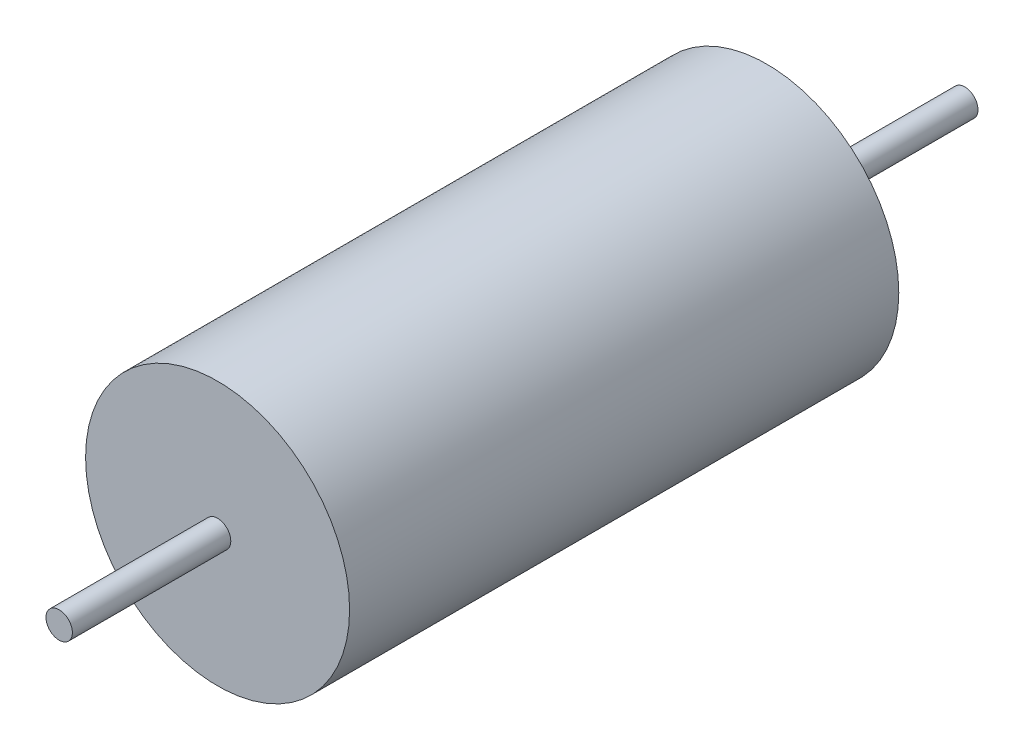
ISO-10303-21;
HEADER;
FILE_DESCRIPTION(('STEP AP214'),'2;1');
FILE_NAME('part.step','',(''),(''),'','','');
FILE_SCHEMA(('AUTOMOTIVE_DESIGN { 1 0 10303 214 1 1 1 1 }'));
ENDSEC;
DATA;
#1=APPLICATION_CONTEXT('core data for automotive mechanical design processes');
#2=APPLICATION_PROTOCOL_DEFINITION('international standard','automotive_design',2000,#1);
#3=PRODUCT_CONTEXT('',#1,'mechanical');
#4=PRODUCT('Part','Part','',(#3));
#5=PRODUCT_RELATED_PRODUCT_CATEGORY('part','',(#4));
#6=PRODUCT_DEFINITION_FORMATION('','',#4);
#7=PRODUCT_DEFINITION_CONTEXT('part definition',#1,'design');
#8=PRODUCT_DEFINITION('design','',#6,#7);
#9=PRODUCT_DEFINITION_SHAPE('','',#8);
#10=(LENGTH_UNIT() NAMED_UNIT(*) SI_UNIT(.MILLI.,.METRE.));
#11=(NAMED_UNIT(*) PLANE_ANGLE_UNIT() SI_UNIT($,.RADIAN.));
#12=(NAMED_UNIT(*) SI_UNIT($,.STERADIAN.) SOLID_ANGLE_UNIT());
#13=UNCERTAINTY_MEASURE_WITH_UNIT(LENGTH_MEASURE(1.E-05),#10,'distance_accuracy_value','');
#14=(GEOMETRIC_REPRESENTATION_CONTEXT(3) GLOBAL_UNCERTAINTY_ASSIGNED_CONTEXT((#13)) GLOBAL_UNIT_ASSIGNED_CONTEXT((#10,
#11,#12)) REPRESENTATION_CONTEXT('',''));
#15=CARTESIAN_POINT('',(0.,0.,0.));
#16=DIRECTION('',(0.,0.,1.));
#17=DIRECTION('',(1.,0.,0.));
#18=AXIS2_PLACEMENT_3D('',#15,#16,#17);
#19=CARTESIAN_POINT('',(0.,0.,7.5));
#20=DIRECTION('',(0.,0.,-1.));
#21=DIRECTION('',(-1.,0.,0.));
#22=AXIS2_PLACEMENT_3D('',#19,#20,#21);
#23=CYLINDRICAL_SURFACE('',#22,0.5);
#24=CARTESIAN_POINT('',(0.,0.,7.5));
#25=DIRECTION('',(0.,0.,1.));
#26=DIRECTION('',(1.,0.,0.));
#27=AXIS2_PLACEMENT_3D('',#24,#25,#26);
#28=CIRCLE('',#27,0.5);
#29=CARTESIAN_POINT('',(0.5,0.,7.5));
#30=VERTEX_POINT('',#29);
#31=EDGE_CURVE('E10',#30,#30,#28,.T.);
#32=ORIENTED_EDGE('',*,*,#31,.F.);
#33=EDGE_LOOP('',(#32));
#34=FACE_BOUND('',#33,.T.);
#35=CARTESIAN_POINT('',(0.,0.,0.));
#36=DIRECTION('',(0.,0.,1.));
#37=DIRECTION('',(1.,0.,0.));
#38=AXIS2_PLACEMENT_3D('',#35,#36,#37);
#39=CIRCLE('',#38,0.5);
#40=CARTESIAN_POINT('',(0.5,0.,0.));
#41=VERTEX_POINT('',#40);
#42=EDGE_CURVE('E35',#41,#41,#39,.T.);
#43=ORIENTED_EDGE('',*,*,#42,.T.);
#44=EDGE_LOOP('',(#43));
#45=FACE_BOUND('',#44,.T.);
#46=ADVANCED_FACE('F32',(#34,#45),#23,.T.);
#47=CARTESIAN_POINT('',(0.,0.,0.));
#48=DIRECTION('',(0.,0.,1.));
#49=DIRECTION('',(1.,0.,0.));
#50=AXIS2_PLACEMENT_3D('',#47,#48,#49);
#51=PLANE('',#50);
#52=ORIENTED_EDGE('',*,*,#42,.F.);
#53=EDGE_LOOP('',(#52));
#54=FACE_BOUND('',#53,.T.);
#55=ADVANCED_FACE('F74',(#54),#51,.F.);
#56=CARTESIAN_POINT('',(0.,0.,28.3));
#57=DIRECTION('',(0.,0.,-1.));
#58=DIRECTION('',(-1.,0.,0.));
#59=AXIS2_PLACEMENT_3D('',#56,#57,#58);
#60=CYLINDRICAL_SURFACE('',#59,5.);
#61=CARTESIAN_POINT('',(0.,0.,28.3));
#62=DIRECTION('',(0.,0.,1.));
#63=DIRECTION('',(1.,0.,0.));
#64=AXIS2_PLACEMENT_3D('',#61,#62,#63);
#65=CIRCLE('',#64,5.);
#66=CARTESIAN_POINT('',(5.,0.,28.3));
#67=VERTEX_POINT('',#66);
#68=EDGE_CURVE('E42',#67,#67,#65,.T.);
#69=ORIENTED_EDGE('',*,*,#68,.F.);
#70=EDGE_LOOP('',(#69));
#71=FACE_BOUND('',#70,.T.);
#72=CARTESIAN_POINT('',(0.,0.,7.5));
#73=DIRECTION('',(0.,0.,1.));
#74=DIRECTION('',(1.,0.,0.));
#75=AXIS2_PLACEMENT_3D('',#72,#73,#74);
#76=CIRCLE('',#75,5.);
#77=CARTESIAN_POINT('',(5.,0.,7.5));
#78=VERTEX_POINT('',#77);
#79=EDGE_CURVE('E44',#78,#78,#76,.T.);
#80=ORIENTED_EDGE('',*,*,#79,.T.);
#81=EDGE_LOOP('',(#80));
#82=FACE_BOUND('',#81,.T.);
#83=ADVANCED_FACE('F68',(#71,#82),#60,.T.);
#84=CARTESIAN_POINT('',(0.,0.,28.3));
#85=DIRECTION('',(0.,0.,1.));
#86=DIRECTION('',(1.,0.,0.));
#87=AXIS2_PLACEMENT_3D('',#84,#85,#86);
#88=PLANE('',#87);
#89=CARTESIAN_POINT('',(0.,0.,28.3));
#90=DIRECTION('',(0.,0.,1.));
#91=DIRECTION('',(1.,0.,0.));
#92=AXIS2_PLACEMENT_3D('',#89,#90,#91);
#93=CIRCLE('',#92,0.5);
#94=CARTESIAN_POINT('',(0.5,0.,28.3));
#95=VERTEX_POINT('',#94);
#96=EDGE_CURVE('E50',#95,#95,#93,.T.);
#97=ORIENTED_EDGE('',*,*,#96,.F.);
#98=EDGE_LOOP('',(#97));
#99=FACE_BOUND('',#98,.T.);
#100=ORIENTED_EDGE('',*,*,#68,.T.);
#101=EDGE_LOOP('',(#100));
#102=FACE_BOUND('',#101,.T.);
#103=ADVANCED_FACE('F65',(#99,#102),#88,.T.);
#104=CARTESIAN_POINT('',(0.,0.,7.5));
#105=DIRECTION('',(0.,0.,1.));
#106=DIRECTION('',(1.,0.,0.));
#107=AXIS2_PLACEMENT_3D('',#104,#105,#106);
#108=PLANE('',#107);
#109=ORIENTED_EDGE('',*,*,#31,.T.);
#110=EDGE_LOOP('',(#109));
#111=FACE_BOUND('',#110,.T.);
#112=ORIENTED_EDGE('',*,*,#79,.F.);
#113=EDGE_LOOP('',(#112));
#114=FACE_BOUND('',#113,.T.);
#115=ADVANCED_FACE('F61',(#111,#114),#108,.F.);
#116=CARTESIAN_POINT('',(0.,0.,34.3));
#117=DIRECTION('',(0.,0.,-1.));
#118=DIRECTION('',(-1.,0.,0.));
#119=AXIS2_PLACEMENT_3D('',#116,#117,#118);
#120=CYLINDRICAL_SURFACE('',#119,0.5);
#121=CARTESIAN_POINT('',(0.,0.,34.3));
#122=DIRECTION('',(0.,0.,1.));
#123=DIRECTION('',(1.,0.,0.));
#124=AXIS2_PLACEMENT_3D('',#121,#122,#123);
#125=CIRCLE('',#124,0.5);
#126=CARTESIAN_POINT('',(0.5,0.,34.3));
#127=VERTEX_POINT('',#126);
#128=EDGE_CURVE('E47',#127,#127,#125,.T.);
#129=ORIENTED_EDGE('',*,*,#128,.F.);
#130=EDGE_LOOP('',(#129));
#131=FACE_BOUND('',#130,.T.);
#132=ORIENTED_EDGE('',*,*,#96,.T.);
#133=EDGE_LOOP('',(#132));
#134=FACE_BOUND('',#133,.T.);
#135=ADVANCED_FACE('F58',(#131,#134),#120,.T.);
#136=CARTESIAN_POINT('',(0.,0.,34.3));
#137=DIRECTION('',(0.,0.,1.));
#138=DIRECTION('',(1.,0.,0.));
#139=AXIS2_PLACEMENT_3D('',#136,#137,#138);
#140=PLANE('',#139);
#141=ORIENTED_EDGE('',*,*,#128,.T.);
#142=EDGE_LOOP('',(#141));
#143=FACE_BOUND('',#142,.T.);
#144=ADVANCED_FACE('F56',(#143),#140,.T.);
#145=CLOSED_SHELL('',(#46,#55,#83,#103,#115,#135,#144));
#146=MANIFOLD_SOLID_BREP('B2',#145);
#147=ADVANCED_BREP_SHAPE_REPRESENTATION('',(#18,#146),#14);
#148=SHAPE_DEFINITION_REPRESENTATION(#9,#147);
ENDSEC;
END-ISO-10303-21;
